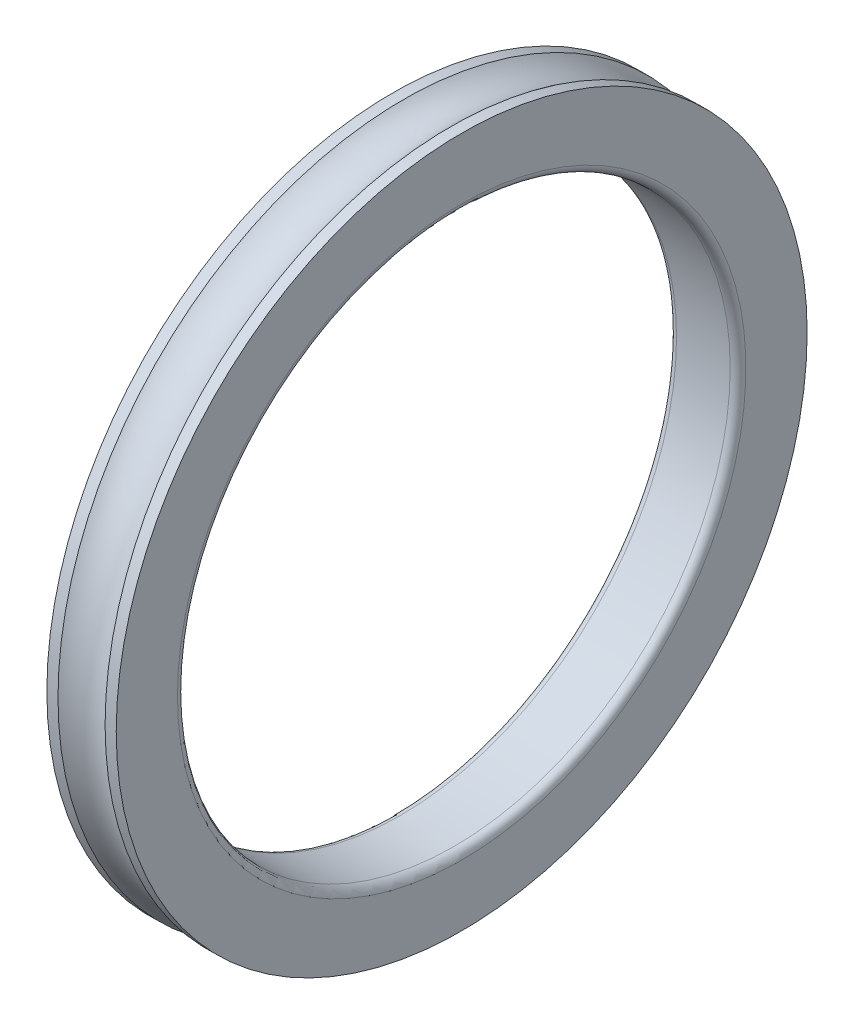
ISO-10303-21;
HEADER;
FILE_DESCRIPTION(('STEP AP214'),'2;1');
FILE_NAME('part.step','',(''),(''),'','','');
FILE_SCHEMA(('AUTOMOTIVE_DESIGN { 1 0 10303 214 1 1 1 1 }'));
ENDSEC;
DATA;
#1=APPLICATION_CONTEXT('core data for automotive mechanical design processes');
#2=APPLICATION_PROTOCOL_DEFINITION('international standard','automotive_design',2000,#1);
#3=PRODUCT_CONTEXT('',#1,'mechanical');
#4=PRODUCT('Part','Part','',(#3));
#5=PRODUCT_RELATED_PRODUCT_CATEGORY('part','',(#4));
#6=PRODUCT_DEFINITION_FORMATION('','',#4);
#7=PRODUCT_DEFINITION_CONTEXT('part definition',#1,'design');
#8=PRODUCT_DEFINITION('design','',#6,#7);
#9=PRODUCT_DEFINITION_SHAPE('','',#8);
#10=(LENGTH_UNIT() NAMED_UNIT(*) SI_UNIT(.MILLI.,.METRE.));
#11=(NAMED_UNIT(*) PLANE_ANGLE_UNIT() SI_UNIT($,.RADIAN.));
#12=(NAMED_UNIT(*) SI_UNIT($,.STERADIAN.) SOLID_ANGLE_UNIT());
#13=UNCERTAINTY_MEASURE_WITH_UNIT(LENGTH_MEASURE(1.E-05),#10,'distance_accuracy_value','');
#14=(GEOMETRIC_REPRESENTATION_CONTEXT(3) GLOBAL_UNCERTAINTY_ASSIGNED_CONTEXT((#13)) GLOBAL_UNIT_ASSIGNED_CONTEXT((#10,
#11,#12)) REPRESENTATION_CONTEXT('',''));
#15=CARTESIAN_POINT('',(0.,0.,0.));
#16=DIRECTION('',(0.,0.,1.));
#17=DIRECTION('',(1.,0.,0.));
#18=AXIS2_PLACEMENT_3D('',#15,#16,#17);
#19=CARTESIAN_POINT('',(2.80506443370304,27.94,0.));
#20=DIRECTION('',(-1.,0.,0.));
#21=DIRECTION('',(0.,0.,1.));
#22=AXIS2_PLACEMENT_3D('',#19,#20,#21);
#23=PLANE('',#22);
#24=CARTESIAN_POINT('',(2.80506443370303,0.,0.));
#25=DIRECTION('',(-1.,0.,0.));
#26=DIRECTION('',(0.,0.,1.));
#27=AXIS2_PLACEMENT_3D('',#24,#25,#26);
#28=CIRCLE('',#27,27.94);
#29=CARTESIAN_POINT('',(2.80506443370303,0.,27.94));
#30=VERTEX_POINT('',#29);
#31=EDGE_CURVE('E72',#30,#30,#28,.T.);
#32=ORIENTED_EDGE('',*,*,#31,.F.);
#33=EDGE_LOOP('',(#32));
#34=FACE_BOUND('',#33,.T.);
#35=CARTESIAN_POINT('',(2.80506443370303,0.,0.));
#36=DIRECTION('',(-1.,0.,0.));
#37=DIRECTION('',(0.,0.,1.));
#38=AXIS2_PLACEMENT_3D('',#35,#36,#37);
#39=CIRCLE('',#38,22.987);
#40=CARTESIAN_POINT('',(2.80506443370303,0.,22.987));
#41=VERTEX_POINT('',#40);
#42=EDGE_CURVE('E10',#41,#41,#39,.T.);
#43=ORIENTED_EDGE('',*,*,#42,.T.);
#44=EDGE_LOOP('',(#43));
#45=FACE_BOUND('',#44,.T.);
#46=ADVANCED_FACE('F37',(#34,#45),#23,.F.);
#47=CARTESIAN_POINT('',(2.17006443370304,0.,0.));
#48=DIRECTION('',(-1.,0.,0.));
#49=DIRECTION('',(0.,0.,1.));
#50=AXIS2_PLACEMENT_3D('',#47,#48,#49);
#51=TOROIDAL_SURFACE('',#50,22.987,0.635);
#52=ORIENTED_EDGE('',*,*,#42,.F.);
#53=EDGE_LOOP('',(#52));
#54=FACE_BOUND('',#53,.T.);
#55=CARTESIAN_POINT('',(2.17006443370303,0.,0.));
#56=DIRECTION('',(-1.,0.,0.));
#57=DIRECTION('',(0.,0.,1.));
#58=AXIS2_PLACEMENT_3D('',#55,#56,#57);
#59=CIRCLE('',#58,22.352);
#60=CARTESIAN_POINT('',(2.17006443370303,0.,22.352));
#61=VERTEX_POINT('',#60);
#62=EDGE_CURVE('E44',#61,#61,#59,.T.);
#63=ORIENTED_EDGE('',*,*,#62,.T.);
#64=EDGE_LOOP('',(#63));
#65=FACE_BOUND('',#64,.T.);
#66=ADVANCED_FACE('F80',(#54,#65),#51,.T.);
#67=CARTESIAN_POINT('',(-23.1950663809922,0.,0.));
#68=DIRECTION('',(-1.,0.,0.));
#69=DIRECTION('',(0.,0.,1.));
#70=AXIS2_PLACEMENT_3D('',#67,#68,#69);
#71=CYLINDRICAL_SURFACE('',#70,22.352);
#72=ORIENTED_EDGE('',*,*,#62,.F.);
#73=EDGE_LOOP('',(#72));
#74=FACE_BOUND('',#73,.T.);
#75=CARTESIAN_POINT('',(-2.17006443370304,0.,0.));
#76=DIRECTION('',(-1.,0.,0.));
#77=DIRECTION('',(0.,0.,1.));
#78=AXIS2_PLACEMENT_3D('',#75,#76,#77);
#79=CIRCLE('',#78,22.352);
#80=CARTESIAN_POINT('',(-2.17006443370304,0.,22.352));
#81=VERTEX_POINT('',#80);
#82=EDGE_CURVE('E49',#81,#81,#79,.T.);
#83=ORIENTED_EDGE('',*,*,#82,.T.);
#84=EDGE_LOOP('',(#83));
#85=FACE_BOUND('',#84,.T.);
#86=ADVANCED_FACE('F84',(#74,#85),#71,.F.);
#87=CARTESIAN_POINT('',(-2.17006443370304,0.,0.));
#88=DIRECTION('',(-1.,0.,0.));
#89=DIRECTION('',(0.,0.,1.));
#90=AXIS2_PLACEMENT_3D('',#87,#88,#89);
#91=TOROIDAL_SURFACE('',#90,22.987,0.635);
#92=ORIENTED_EDGE('',*,*,#82,.F.);
#93=EDGE_LOOP('',(#92));
#94=FACE_BOUND('',#93,.T.);
#95=CARTESIAN_POINT('',(-2.80506443370304,0.,0.));
#96=DIRECTION('',(-1.,0.,0.));
#97=DIRECTION('',(0.,0.,1.));
#98=AXIS2_PLACEMENT_3D('',#95,#96,#97);
#99=CIRCLE('',#98,22.987);
#100=CARTESIAN_POINT('',(-2.80506443370304,0.,22.987));
#101=VERTEX_POINT('',#100);
#102=EDGE_CURVE('E54',#101,#101,#99,.T.);
#103=ORIENTED_EDGE('',*,*,#102,.T.);
#104=EDGE_LOOP('',(#103));
#105=FACE_BOUND('',#104,.T.);
#106=ADVANCED_FACE('F89',(#94,#105),#91,.T.);
#107=CARTESIAN_POINT('',(-2.80506443370304,27.94,0.));
#108=DIRECTION('',(1.,0.,0.));
#109=DIRECTION('',(0.,0.,-1.));
#110=AXIS2_PLACEMENT_3D('',#107,#108,#109);
#111=PLANE('',#110);
#112=ORIENTED_EDGE('',*,*,#102,.F.);
#113=EDGE_LOOP('',(#112));
#114=FACE_BOUND('',#113,.T.);
#115=CARTESIAN_POINT('',(-2.80506443370304,0.,0.));
#116=DIRECTION('',(-1.,0.,0.));
#117=DIRECTION('',(0.,0.,1.));
#118=AXIS2_PLACEMENT_3D('',#115,#116,#117);
#119=CIRCLE('',#118,27.94);
#120=CARTESIAN_POINT('',(-2.80506443370304,0.,27.94));
#121=VERTEX_POINT('',#120);
#122=EDGE_CURVE('E60',#121,#121,#119,.T.);
#123=ORIENTED_EDGE('',*,*,#122,.T.);
#124=EDGE_LOOP('',(#123));
#125=FACE_BOUND('',#124,.T.);
#126=ADVANCED_FACE('F95',(#114,#125),#111,.F.);
#127=CARTESIAN_POINT('',(-23.1950663809922,0.,0.));
#128=DIRECTION('',(-1.,0.,0.));
#129=DIRECTION('',(0.,0.,1.));
#130=AXIS2_PLACEMENT_3D('',#127,#128,#129);
#131=CYLINDRICAL_SURFACE('',#130,27.94);
#132=ORIENTED_EDGE('',*,*,#122,.F.);
#133=EDGE_LOOP('',(#132));
#134=FACE_BOUND('',#133,.T.);
#135=CARTESIAN_POINT('',(-1.905,0.,0.));
#136=DIRECTION('',(-1.,0.,0.));
#137=DIRECTION('',(0.,0.,1.));
#138=AXIS2_PLACEMENT_3D('',#135,#136,#137);
#139=CIRCLE('',#138,27.94);
#140=CARTESIAN_POINT('',(-1.905,0.,27.94));
#141=VERTEX_POINT('',#140);
#142=EDGE_CURVE('E64',#141,#141,#139,.T.);
#143=ORIENTED_EDGE('',*,*,#142,.T.);
#144=EDGE_LOOP('',(#143));
#145=FACE_BOUND('',#144,.T.);
#146=ADVANCED_FACE('F99',(#134,#145),#131,.T.);
#147=CARTESIAN_POINT('',(0.,0.,0.));
#148=DIRECTION('',(-1.,0.,0.));
#149=DIRECTION('',(0.,0.,1.));
#150=AXIS2_PLACEMENT_3D('',#147,#148,#149);
#151=TOROIDAL_SURFACE('',#150,30.48,3.175);
#152=ORIENTED_EDGE('',*,*,#142,.F.);
#153=EDGE_LOOP('',(#152));
#154=FACE_BOUND('',#153,.T.);
#155=CARTESIAN_POINT('',(1.90499999999999,0.,0.));
#156=DIRECTION('',(-1.,0.,0.));
#157=DIRECTION('',(0.,0.,1.));
#158=AXIS2_PLACEMENT_3D('',#155,#156,#157);
#159=CIRCLE('',#158,27.94);
#160=CARTESIAN_POINT('',(1.90499999999999,0.,27.94));
#161=VERTEX_POINT('',#160);
#162=EDGE_CURVE('E68',#161,#161,#159,.T.);
#163=ORIENTED_EDGE('',*,*,#162,.T.);
#164=EDGE_LOOP('',(#163));
#165=FACE_BOUND('',#164,.T.);
#166=ADVANCED_FACE('F103',(#154,#165),#151,.F.);
#167=CARTESIAN_POINT('',(-23.1950663809922,0.,0.));
#168=DIRECTION('',(-1.,0.,0.));
#169=DIRECTION('',(0.,0.,1.));
#170=AXIS2_PLACEMENT_3D('',#167,#168,#169);
#171=CYLINDRICAL_SURFACE('',#170,27.94);
#172=ORIENTED_EDGE('',*,*,#162,.F.);
#173=EDGE_LOOP('',(#172));
#174=FACE_BOUND('',#173,.T.);
#175=ORIENTED_EDGE('',*,*,#31,.T.);
#176=EDGE_LOOP('',(#175));
#177=FACE_BOUND('',#176,.T.);
#178=ADVANCED_FACE('F77',(#174,#177),#171,.T.);
#179=CLOSED_SHELL('',(#46,#66,#86,#106,#126,#146,#166,#178));
#180=MANIFOLD_SOLID_BREP('B2',#179);
#181=ADVANCED_BREP_SHAPE_REPRESENTATION('',(#18,#180),#14);
#182=SHAPE_DEFINITION_REPRESENTATION(#9,#181);
ENDSEC;
END-ISO-10303-21;
